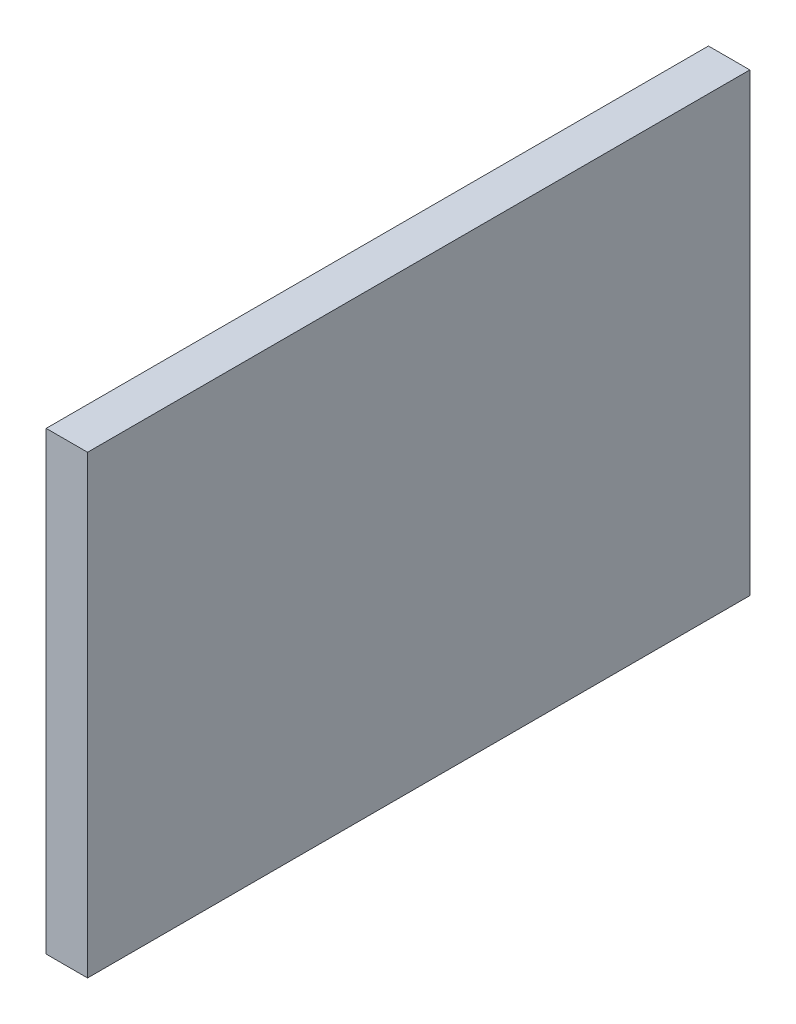
ISO-10303-21;
HEADER;
FILE_DESCRIPTION(('STEP AP214'),'2;1');
FILE_NAME('part.step','',(''),(''),'','','');
FILE_SCHEMA(('AUTOMOTIVE_DESIGN { 1 0 10303 214 1 1 1 1 }'));
ENDSEC;
DATA;
#1=APPLICATION_CONTEXT('core data for automotive mechanical design processes');
#2=APPLICATION_PROTOCOL_DEFINITION('international standard','automotive_design',2000,#1);
#3=PRODUCT_CONTEXT('',#1,'mechanical');
#4=PRODUCT('Part','Part','',(#3));
#5=PRODUCT_RELATED_PRODUCT_CATEGORY('part','',(#4));
#6=PRODUCT_DEFINITION_FORMATION('','',#4);
#7=PRODUCT_DEFINITION_CONTEXT('part definition',#1,'design');
#8=PRODUCT_DEFINITION('design','',#6,#7);
#9=PRODUCT_DEFINITION_SHAPE('','',#8);
#10=(LENGTH_UNIT() NAMED_UNIT(*) SI_UNIT(.MILLI.,.METRE.));
#11=(NAMED_UNIT(*) PLANE_ANGLE_UNIT() SI_UNIT($,.RADIAN.));
#12=(NAMED_UNIT(*) SI_UNIT($,.STERADIAN.) SOLID_ANGLE_UNIT());
#13=UNCERTAINTY_MEASURE_WITH_UNIT(LENGTH_MEASURE(1.E-05),#10,'distance_accuracy_value','');
#14=(GEOMETRIC_REPRESENTATION_CONTEXT(3) GLOBAL_UNCERTAINTY_ASSIGNED_CONTEXT((#13)) GLOBAL_UNIT_ASSIGNED_CONTEXT((#10,
#11,#12)) REPRESENTATION_CONTEXT('',''));
#15=CARTESIAN_POINT('',(0.,0.,0.));
#16=DIRECTION('',(0.,0.,1.));
#17=DIRECTION('',(1.,0.,0.));
#18=AXIS2_PLACEMENT_3D('',#15,#16,#17);
#19=CARTESIAN_POINT('',(10.,-55.,-80.));
#20=DIRECTION('',(0.,0.,1.));
#21=DIRECTION('',(1.,0.,0.));
#22=AXIS2_PLACEMENT_3D('',#19,#20,#21);
#23=PLANE('',#22);
#24=DIRECTION('',(0.,1.,0.));
#25=VECTOR('',#24,1.);
#26=CARTESIAN_POINT('',(0.,-55.,-80.));
#27=LINE('',#26,#25);
#28=CARTESIAN_POINT('',(0.,-55.,-80.));
#29=VERTEX_POINT('',#28);
#30=CARTESIAN_POINT('',(0.,55.,-80.));
#31=VERTEX_POINT('',#30);
#32=EDGE_CURVE('E96',#29,#31,#27,.T.);
#33=ORIENTED_EDGE('',*,*,#32,.T.);
#34=DIRECTION('',(-1.,0.,0.));
#35=VECTOR('',#34,1.);
#36=CARTESIAN_POINT('',(10.,55.,-80.));
#37=LINE('',#36,#35);
#38=CARTESIAN_POINT('',(10.,55.,-80.));
#39=VERTEX_POINT('',#38);
#40=EDGE_CURVE('E11',#39,#31,#37,.T.);
#41=ORIENTED_EDGE('',*,*,#40,.F.);
#42=DIRECTION('',(0.,1.,0.));
#43=VECTOR('',#42,1.);
#44=CARTESIAN_POINT('',(10.,-55.,-80.));
#45=LINE('',#44,#43);
#46=CARTESIAN_POINT('',(10.,-55.,-80.));
#47=VERTEX_POINT('',#46);
#48=EDGE_CURVE('E84',#47,#39,#45,.T.);
#49=ORIENTED_EDGE('',*,*,#48,.F.);
#50=DIRECTION('',(-1.,0.,0.));
#51=VECTOR('',#50,1.);
#52=CARTESIAN_POINT('',(10.,-55.,-80.));
#53=LINE('',#52,#51);
#54=EDGE_CURVE('E92',#47,#29,#53,.T.);
#55=ORIENTED_EDGE('',*,*,#54,.T.);
#56=EDGE_LOOP('',(#33,#41,#49,#55));
#57=FACE_BOUND('',#56,.T.);
#58=ADVANCED_FACE('F33',(#57),#23,.F.);
#59=CARTESIAN_POINT('',(10.,55.,80.));
#60=DIRECTION('',(0.,-1.,0.));
#61=DIRECTION('',(0.,0.,-1.));
#62=AXIS2_PLACEMENT_3D('',#59,#60,#61);
#63=PLANE('',#62);
#64=DIRECTION('',(0.,0.,1.));
#65=VECTOR('',#64,1.);
#66=CARTESIAN_POINT('',(0.,55.,80.));
#67=LINE('',#66,#65);
#68=CARTESIAN_POINT('',(0.,55.,80.));
#69=VERTEX_POINT('',#68);
#70=EDGE_CURVE('E88',#31,#69,#67,.T.);
#71=ORIENTED_EDGE('',*,*,#70,.T.);
#72=DIRECTION('',(-1.,0.,0.));
#73=VECTOR('',#72,1.);
#74=CARTESIAN_POINT('',(10.,55.,80.));
#75=LINE('',#74,#73);
#76=CARTESIAN_POINT('',(10.,55.,80.));
#77=VERTEX_POINT('',#76);
#78=EDGE_CURVE('E41',#77,#69,#75,.T.);
#79=ORIENTED_EDGE('',*,*,#78,.F.);
#80=DIRECTION('',(0.,0.,1.));
#81=VECTOR('',#80,1.);
#82=CARTESIAN_POINT('',(10.,55.,80.));
#83=LINE('',#82,#81);
#84=EDGE_CURVE('E79',#39,#77,#83,.T.);
#85=ORIENTED_EDGE('',*,*,#84,.F.);
#86=ORIENTED_EDGE('',*,*,#40,.T.);
#87=EDGE_LOOP('',(#71,#79,#85,#86));
#88=FACE_BOUND('',#87,.T.);
#89=ADVANCED_FACE('F87',(#88),#63,.F.);
#90=CARTESIAN_POINT('',(10.,-55.,80.));
#91=DIRECTION('',(0.,0.,-1.));
#92=DIRECTION('',(-1.,0.,0.));
#93=AXIS2_PLACEMENT_3D('',#90,#91,#92);
#94=PLANE('',#93);
#95=DIRECTION('',(0.,-1.,0.));
#96=VECTOR('',#95,1.);
#97=CARTESIAN_POINT('',(0.,-55.,80.));
#98=LINE('',#97,#96);
#99=CARTESIAN_POINT('',(0.,-55.,80.));
#100=VERTEX_POINT('',#99);
#101=EDGE_CURVE('E66',#69,#100,#98,.T.);
#102=ORIENTED_EDGE('',*,*,#101,.T.);
#103=DIRECTION('',(-1.,0.,0.));
#104=VECTOR('',#103,1.);
#105=CARTESIAN_POINT('',(10.,-55.,80.));
#106=LINE('',#105,#104);
#107=CARTESIAN_POINT('',(10.,-55.,80.));
#108=VERTEX_POINT('',#107);
#109=EDGE_CURVE('E89',#108,#100,#106,.T.);
#110=ORIENTED_EDGE('',*,*,#109,.F.);
#111=DIRECTION('',(0.,-1.,0.));
#112=VECTOR('',#111,1.);
#113=CARTESIAN_POINT('',(10.,-55.,80.));
#114=LINE('',#113,#112);
#115=EDGE_CURVE('E82',#77,#108,#114,.T.);
#116=ORIENTED_EDGE('',*,*,#115,.F.);
#117=ORIENTED_EDGE('',*,*,#78,.T.);
#118=EDGE_LOOP('',(#102,#110,#116,#117));
#119=FACE_BOUND('',#118,.T.);
#120=ADVANCED_FACE('F90',(#119),#94,.F.);
#121=CARTESIAN_POINT('',(10.,-55.,80.));
#122=DIRECTION('',(0.,1.,0.));
#123=DIRECTION('',(0.,0.,1.));
#124=AXIS2_PLACEMENT_3D('',#121,#122,#123);
#125=PLANE('',#124);
#126=DIRECTION('',(0.,0.,-1.));
#127=VECTOR('',#126,1.);
#128=CARTESIAN_POINT('',(0.,-55.,80.));
#129=LINE('',#128,#127);
#130=EDGE_CURVE('E72',#100,#29,#129,.T.);
#131=ORIENTED_EDGE('',*,*,#130,.T.);
#132=ORIENTED_EDGE('',*,*,#54,.F.);
#133=DIRECTION('',(0.,0.,-1.));
#134=VECTOR('',#133,1.);
#135=CARTESIAN_POINT('',(10.,-55.,80.));
#136=LINE('',#135,#134);
#137=EDGE_CURVE('E49',#108,#47,#136,.T.);
#138=ORIENTED_EDGE('',*,*,#137,.F.);
#139=ORIENTED_EDGE('',*,*,#109,.T.);
#140=EDGE_LOOP('',(#131,#132,#138,#139));
#141=FACE_BOUND('',#140,.T.);
#142=ADVANCED_FACE('F103',(#141),#125,.F.);
#143=CARTESIAN_POINT('',(10.,0.,0.));
#144=DIRECTION('',(-1.,0.,0.));
#145=DIRECTION('',(0.,0.,1.));
#146=AXIS2_PLACEMENT_3D('',#143,#144,#145);
#147=PLANE('',#146);
#148=ORIENTED_EDGE('',*,*,#48,.T.);
#149=ORIENTED_EDGE('',*,*,#84,.T.);
#150=ORIENTED_EDGE('',*,*,#115,.T.);
#151=ORIENTED_EDGE('',*,*,#137,.T.);
#152=EDGE_LOOP('',(#148,#149,#150,#151));
#153=FACE_BOUND('',#152,.T.);
#154=ADVANCED_FACE('F80',(#153),#147,.F.);
#155=CARTESIAN_POINT('',(0.,0.,0.));
#156=DIRECTION('',(-1.,0.,0.));
#157=DIRECTION('',(0.,0.,1.));
#158=AXIS2_PLACEMENT_3D('',#155,#156,#157);
#159=PLANE('',#158);
#160=ORIENTED_EDGE('',*,*,#32,.F.);
#161=ORIENTED_EDGE('',*,*,#130,.F.);
#162=ORIENTED_EDGE('',*,*,#101,.F.);
#163=ORIENTED_EDGE('',*,*,#70,.F.);
#164=EDGE_LOOP('',(#160,#161,#162,#163));
#165=FACE_BOUND('',#164,.T.);
#166=ADVANCED_FACE('F106',(#165),#159,.T.);
#167=CLOSED_SHELL('',(#58,#89,#120,#142,#154,#166));
#168=MANIFOLD_SOLID_BREP('B2',#167);
#169=ADVANCED_BREP_SHAPE_REPRESENTATION('',(#18,#168),#14);
#170=SHAPE_DEFINITION_REPRESENTATION(#9,#169);
ENDSEC;
END-ISO-10303-21;
